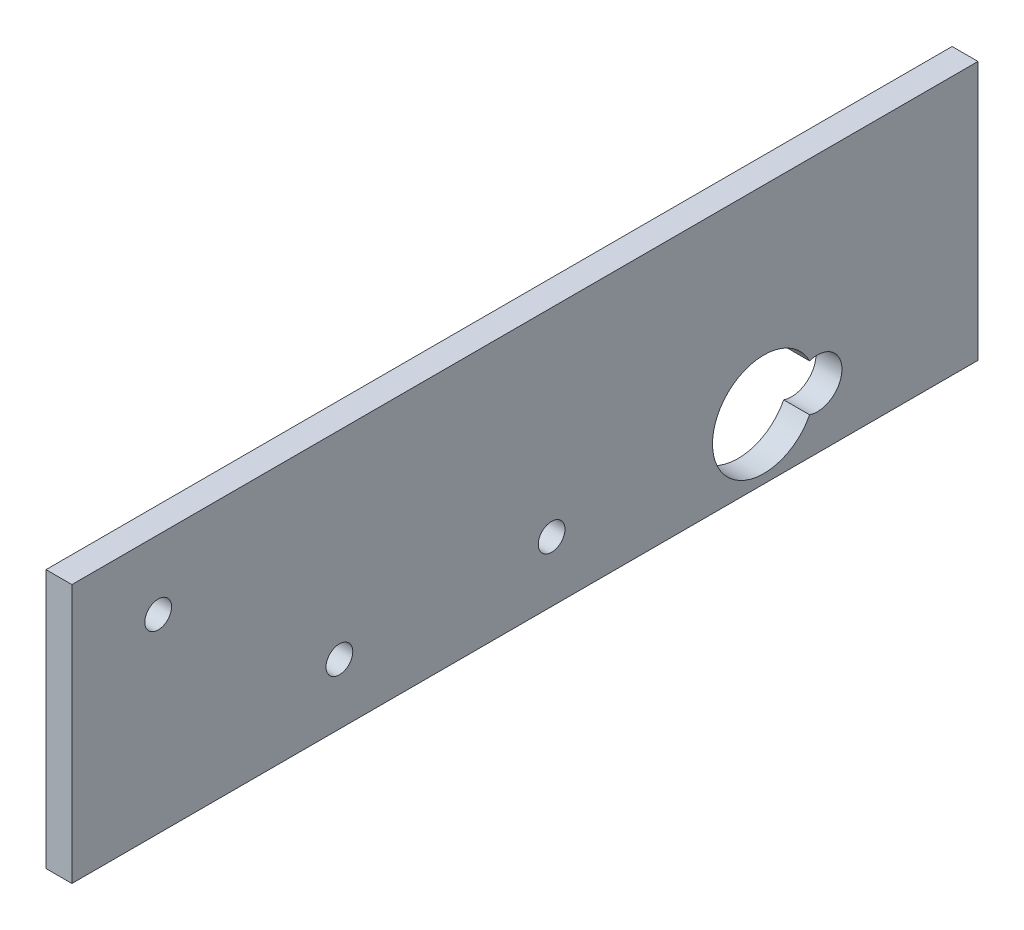
ISO-10303-21;
HEADER;
FILE_DESCRIPTION(('STEP AP214'),'2;1');
FILE_NAME('part.step','',(''),(''),'','','');
FILE_SCHEMA(('AUTOMOTIVE_DESIGN { 1 0 10303 214 1 1 1 1 }'));
ENDSEC;
DATA;
#1=APPLICATION_CONTEXT('core data for automotive mechanical design processes');
#2=APPLICATION_PROTOCOL_DEFINITION('international standard','automotive_design',2000,#1);
#3=PRODUCT_CONTEXT('',#1,'mechanical');
#4=PRODUCT('Part','Part','',(#3));
#5=PRODUCT_RELATED_PRODUCT_CATEGORY('part','',(#4));
#6=PRODUCT_DEFINITION_FORMATION('','',#4);
#7=PRODUCT_DEFINITION_CONTEXT('part definition',#1,'design');
#8=PRODUCT_DEFINITION('design','',#6,#7);
#9=PRODUCT_DEFINITION_SHAPE('','',#8);
#10=(LENGTH_UNIT() NAMED_UNIT(*) SI_UNIT(.MILLI.,.METRE.));
#11=(NAMED_UNIT(*) PLANE_ANGLE_UNIT() SI_UNIT($,.RADIAN.));
#12=(NAMED_UNIT(*) SI_UNIT($,.STERADIAN.) SOLID_ANGLE_UNIT());
#13=UNCERTAINTY_MEASURE_WITH_UNIT(LENGTH_MEASURE(1.E-05),#10,'distance_accuracy_value','');
#14=(GEOMETRIC_REPRESENTATION_CONTEXT(3) GLOBAL_UNCERTAINTY_ASSIGNED_CONTEXT((#13)) GLOBAL_UNIT_ASSIGNED_CONTEXT((#10,
#11,#12)) REPRESENTATION_CONTEXT('',''));
#15=CARTESIAN_POINT('',(0.,0.,0.));
#16=DIRECTION('',(0.,0.,1.));
#17=DIRECTION('',(1.,0.,0.));
#18=AXIS2_PLACEMENT_3D('',#15,#16,#17);
#19=CARTESIAN_POINT('',(3.,0.,0.));
#20=DIRECTION('',(0.,0.,-1.));
#21=DIRECTION('',(-1.,0.,0.));
#22=AXIS2_PLACEMENT_3D('',#19,#20,#21);
#23=PLANE('',#22);
#24=DIRECTION('',(0.,-1.,0.));
#25=VECTOR('',#24,1.);
#26=CARTESIAN_POINT('',(0.,0.,0.));
#27=LINE('',#26,#25);
#28=CARTESIAN_POINT('',(0.,30.,0.));
#29=VERTEX_POINT('',#28);
#30=CARTESIAN_POINT('',(0.,0.,0.));
#31=VERTEX_POINT('',#30);
#32=EDGE_CURVE('E118',#29,#31,#27,.T.);
#33=ORIENTED_EDGE('',*,*,#32,.T.);
#34=DIRECTION('',(-1.,0.,0.));
#35=VECTOR('',#34,1.);
#36=CARTESIAN_POINT('',(3.,0.,0.));
#37=LINE('',#36,#35);
#38=CARTESIAN_POINT('',(3.,0.,0.));
#39=VERTEX_POINT('',#38);
#40=EDGE_CURVE('E11',#39,#31,#37,.T.);
#41=ORIENTED_EDGE('',*,*,#40,.F.);
#42=DIRECTION('',(0.,-1.,0.));
#43=VECTOR('',#42,1.);
#44=CARTESIAN_POINT('',(3.,0.,0.));
#45=LINE('',#44,#43);
#46=CARTESIAN_POINT('',(3.,30.,0.));
#47=VERTEX_POINT('',#46);
#48=EDGE_CURVE('E139',#47,#39,#45,.T.);
#49=ORIENTED_EDGE('',*,*,#48,.F.);
#50=DIRECTION('',(-1.,0.,0.));
#51=VECTOR('',#50,1.);
#52=CARTESIAN_POINT('',(3.,30.,0.));
#53=LINE('',#52,#51);
#54=EDGE_CURVE('E153',#47,#29,#53,.T.);
#55=ORIENTED_EDGE('',*,*,#54,.T.);
#56=EDGE_LOOP('',(#33,#41,#49,#55));
#57=FACE_BOUND('',#56,.T.);
#58=ADVANCED_FACE('F39',(#57),#23,.F.);
#59=CARTESIAN_POINT('',(3.,0.,0.));
#60=DIRECTION('',(0.,1.,0.));
#61=DIRECTION('',(0.,0.,1.));
#62=AXIS2_PLACEMENT_3D('',#59,#60,#61);
#63=PLANE('',#62);
#64=DIRECTION('',(0.,0.,-1.));
#65=VECTOR('',#64,1.);
#66=CARTESIAN_POINT('',(0.,0.,0.));
#67=LINE('',#66,#65);
#68=CARTESIAN_POINT('',(0.,0.,-105.));
#69=VERTEX_POINT('',#68);
#70=EDGE_CURVE('E157',#31,#69,#67,.T.);
#71=ORIENTED_EDGE('',*,*,#70,.T.);
#72=DIRECTION('',(-1.,0.,0.));
#73=VECTOR('',#72,1.);
#74=CARTESIAN_POINT('',(3.,0.,-105.));
#75=LINE('',#74,#73);
#76=CARTESIAN_POINT('',(3.,0.,-105.));
#77=VERTEX_POINT('',#76);
#78=EDGE_CURVE('E47',#77,#69,#75,.T.);
#79=ORIENTED_EDGE('',*,*,#78,.F.);
#80=DIRECTION('',(0.,0.,-1.));
#81=VECTOR('',#80,1.);
#82=CARTESIAN_POINT('',(3.,0.,0.));
#83=LINE('',#82,#81);
#84=EDGE_CURVE('E143',#39,#77,#83,.T.);
#85=ORIENTED_EDGE('',*,*,#84,.F.);
#86=ORIENTED_EDGE('',*,*,#40,.T.);
#87=EDGE_LOOP('',(#71,#79,#85,#86));
#88=FACE_BOUND('',#87,.T.);
#89=ADVANCED_FACE('F192',(#88),#63,.F.);
#90=CARTESIAN_POINT('',(3.,0.,-105.));
#91=DIRECTION('',(0.,0.,1.));
#92=DIRECTION('',(1.,0.,0.));
#93=AXIS2_PLACEMENT_3D('',#90,#91,#92);
#94=PLANE('',#93);
#95=DIRECTION('',(0.,1.,0.));
#96=VECTOR('',#95,1.);
#97=CARTESIAN_POINT('',(0.,0.,-105.));
#98=LINE('',#97,#96);
#99=CARTESIAN_POINT('',(0.,30.,-105.));
#100=VERTEX_POINT('',#99);
#101=EDGE_CURVE('E160',#69,#100,#98,.T.);
#102=ORIENTED_EDGE('',*,*,#101,.T.);
#103=DIRECTION('',(-1.,0.,0.));
#104=VECTOR('',#103,1.);
#105=CARTESIAN_POINT('',(3.,30.,-105.));
#106=LINE('',#105,#104);
#107=CARTESIAN_POINT('',(3.,30.,-105.));
#108=VERTEX_POINT('',#107);
#109=EDGE_CURVE('E168',#108,#100,#106,.T.);
#110=ORIENTED_EDGE('',*,*,#109,.F.);
#111=DIRECTION('',(0.,1.,0.));
#112=VECTOR('',#111,1.);
#113=CARTESIAN_POINT('',(3.,0.,-105.));
#114=LINE('',#113,#112);
#115=EDGE_CURVE('E147',#77,#108,#114,.T.);
#116=ORIENTED_EDGE('',*,*,#115,.F.);
#117=ORIENTED_EDGE('',*,*,#78,.T.);
#118=EDGE_LOOP('',(#102,#110,#116,#117));
#119=FACE_BOUND('',#118,.T.);
#120=ADVANCED_FACE('F177',(#119),#94,.F.);
#121=CARTESIAN_POINT('',(3.,30.,0.));
#122=DIRECTION('',(0.,-1.,0.));
#123=DIRECTION('',(0.,0.,-1.));
#124=AXIS2_PLACEMENT_3D('',#121,#122,#123);
#125=PLANE('',#124);
#126=DIRECTION('',(0.,0.,1.));
#127=VECTOR('',#126,1.);
#128=CARTESIAN_POINT('',(0.,30.,0.));
#129=LINE('',#128,#127);
#130=EDGE_CURVE('E144',#100,#29,#129,.T.);
#131=ORIENTED_EDGE('',*,*,#130,.T.);
#132=ORIENTED_EDGE('',*,*,#54,.F.);
#133=DIRECTION('',(0.,0.,1.));
#134=VECTOR('',#133,1.);
#135=CARTESIAN_POINT('',(3.,30.,0.));
#136=LINE('',#135,#134);
#137=EDGE_CURVE('E150',#108,#47,#136,.T.);
#138=ORIENTED_EDGE('',*,*,#137,.F.);
#139=ORIENTED_EDGE('',*,*,#109,.T.);
#140=EDGE_LOOP('',(#131,#132,#138,#139));
#141=FACE_BOUND('',#140,.T.);
#142=ADVANCED_FACE('F185',(#141),#125,.F.);
#143=CARTESIAN_POINT('',(3.,0.,0.));
#144=DIRECTION('',(-1.,0.,0.));
#145=DIRECTION('',(0.,0.,1.));
#146=AXIS2_PLACEMENT_3D('',#143,#144,#145);
#147=PLANE('',#146);
#148=CARTESIAN_POINT('',(3.,7.,-80.183749339151));
#149=DIRECTION('',(-1.,0.,0.));
#150=DIRECTION('',(0.,0.,1.));
#151=AXIS2_PLACEMENT_3D('',#148,#149,#150);
#152=CIRCLE('',#151,5.94999999999999);
#153=CARTESIAN_POINT('',(3.,4.29583654340201,-85.483749339151));
#154=VERTEX_POINT('',#153);
#155=CARTESIAN_POINT('',(3.,9.704163456598,-85.483749339151));
#156=VERTEX_POINT('',#155);
#157=EDGE_CURVE('E92',#154,#156,#152,.T.);
#158=ORIENTED_EDGE('',*,*,#157,.T.);
#159=CARTESIAN_POINT('',(3.,7.,-86.3837493391511));
#160=DIRECTION('',(-1.,0.,0.));
#161=DIRECTION('',(0.,0.,1.));
#162=AXIS2_PLACEMENT_3D('',#159,#160,#161);
#163=CIRCLE('',#162,2.85000000000001);
#164=EDGE_CURVE('E113',#156,#154,#163,.T.);
#165=ORIENTED_EDGE('',*,*,#164,.T.);
#166=EDGE_LOOP('',(#158,#165));
#167=FACE_BOUND('',#166,.T.);
#168=CARTESIAN_POINT('',(3.,22.,-10.));
#169=DIRECTION('',(1.,0.,0.));
#170=DIRECTION('',(0.,0.,-1.));
#171=AXIS2_PLACEMENT_3D('',#168,#169,#170);
#172=CIRCLE('',#171,1.55);
#173=CARTESIAN_POINT('',(3.,22.,-11.55));
#174=VERTEX_POINT('',#173);
#175=EDGE_CURVE('E119',#174,#174,#172,.T.);
#176=ORIENTED_EDGE('',*,*,#175,.F.);
#177=EDGE_LOOP('',(#176));
#178=FACE_BOUND('',#177,.T.);
#179=CARTESIAN_POINT('',(3.,7.,-31.));
#180=DIRECTION('',(1.,0.,0.));
#181=DIRECTION('',(0.,0.,-1.));
#182=AXIS2_PLACEMENT_3D('',#179,#180,#181);
#183=CIRCLE('',#182,1.54999999999999);
#184=CARTESIAN_POINT('',(3.,7.,-32.55));
#185=VERTEX_POINT('',#184);
#186=EDGE_CURVE('E127',#185,#185,#183,.T.);
#187=ORIENTED_EDGE('',*,*,#186,.F.);
#188=EDGE_LOOP('',(#187));
#189=FACE_BOUND('',#188,.T.);
#190=CARTESIAN_POINT('',(3.,7.,-55.5918746695755));
#191=DIRECTION('',(1.,0.,0.));
#192=DIRECTION('',(0.,0.,-1.));
#193=AXIS2_PLACEMENT_3D('',#190,#191,#192);
#194=CIRCLE('',#193,1.55);
#195=CARTESIAN_POINT('',(3.,7.,-57.1418746695755));
#196=VERTEX_POINT('',#195);
#197=EDGE_CURVE('E135',#196,#196,#194,.T.);
#198=ORIENTED_EDGE('',*,*,#197,.F.);
#199=EDGE_LOOP('',(#198));
#200=FACE_BOUND('',#199,.T.);
#201=ORIENTED_EDGE('',*,*,#48,.T.);
#202=ORIENTED_EDGE('',*,*,#84,.T.);
#203=ORIENTED_EDGE('',*,*,#115,.T.);
#204=ORIENTED_EDGE('',*,*,#137,.T.);
#205=EDGE_LOOP('',(#201,#202,#203,#204));
#206=FACE_BOUND('',#205,.T.);
#207=ADVANCED_FACE('F191',(#167,#178,#189,#200,#206),#147,.F.);
#208=CARTESIAN_POINT('',(0.,0.,0.));
#209=DIRECTION('',(-1.,0.,0.));
#210=DIRECTION('',(0.,0.,1.));
#211=AXIS2_PLACEMENT_3D('',#208,#209,#210);
#212=PLANE('',#211);
#213=CARTESIAN_POINT('',(0.,7.,-86.3837493391511));
#214=DIRECTION('',(1.,0.,0.));
#215=DIRECTION('',(0.,0.,-1.));
#216=AXIS2_PLACEMENT_3D('',#213,#214,#215);
#217=CIRCLE('',#216,2.85000000000001);
#218=CARTESIAN_POINT('',(0.,4.295836543402,-85.483749339151));
#219=VERTEX_POINT('',#218);
#220=CARTESIAN_POINT('',(0.,9.704163456598,-85.483749339151));
#221=VERTEX_POINT('',#220);
#222=EDGE_CURVE('E98',#219,#221,#217,.T.);
#223=ORIENTED_EDGE('',*,*,#222,.T.);
#224=CARTESIAN_POINT('',(0.,7.,-80.183749339151));
#225=DIRECTION('',(1.,0.,0.));
#226=DIRECTION('',(0.,0.,-1.));
#227=AXIS2_PLACEMENT_3D('',#224,#225,#226);
#228=CIRCLE('',#227,5.94999999999999);
#229=EDGE_CURVE('E61',#221,#219,#228,.T.);
#230=ORIENTED_EDGE('',*,*,#229,.T.);
#231=EDGE_LOOP('',(#223,#230));
#232=FACE_BOUND('',#231,.T.);
#233=CARTESIAN_POINT('',(0.,22.,-10.));
#234=DIRECTION('',(1.,0.,0.));
#235=DIRECTION('',(0.,0.,-1.));
#236=AXIS2_PLACEMENT_3D('',#233,#234,#235);
#237=CIRCLE('',#236,1.55);
#238=CARTESIAN_POINT('',(0.,22.,-11.55));
#239=VERTEX_POINT('',#238);
#240=EDGE_CURVE('E114',#239,#239,#237,.T.);
#241=ORIENTED_EDGE('',*,*,#240,.T.);
#242=EDGE_LOOP('',(#241));
#243=FACE_BOUND('',#242,.T.);
#244=CARTESIAN_POINT('',(0.,7.,-31.));
#245=DIRECTION('',(1.,0.,0.));
#246=DIRECTION('',(0.,0.,-1.));
#247=AXIS2_PLACEMENT_3D('',#244,#245,#246);
#248=CIRCLE('',#247,1.54999999999999);
#249=CARTESIAN_POINT('',(0.,7.,-32.55));
#250=VERTEX_POINT('',#249);
#251=EDGE_CURVE('E123',#250,#250,#248,.T.);
#252=ORIENTED_EDGE('',*,*,#251,.T.);
#253=EDGE_LOOP('',(#252));
#254=FACE_BOUND('',#253,.T.);
#255=CARTESIAN_POINT('',(0.,7.,-55.5918746695755));
#256=DIRECTION('',(1.,0.,0.));
#257=DIRECTION('',(0.,0.,-1.));
#258=AXIS2_PLACEMENT_3D('',#255,#256,#257);
#259=CIRCLE('',#258,1.55);
#260=CARTESIAN_POINT('',(0.,7.,-57.1418746695755));
#261=VERTEX_POINT('',#260);
#262=EDGE_CURVE('E131',#261,#261,#259,.T.);
#263=ORIENTED_EDGE('',*,*,#262,.T.);
#264=EDGE_LOOP('',(#263));
#265=FACE_BOUND('',#264,.T.);
#266=ORIENTED_EDGE('',*,*,#32,.F.);
#267=ORIENTED_EDGE('',*,*,#130,.F.);
#268=ORIENTED_EDGE('',*,*,#101,.F.);
#269=ORIENTED_EDGE('',*,*,#70,.F.);
#270=EDGE_LOOP('',(#266,#267,#268,#269));
#271=FACE_BOUND('',#270,.T.);
#272=ADVANCED_FACE('F103',(#232,#243,#254,#265,#271),#212,.T.);
#273=CARTESIAN_POINT('',(0.,7.,-55.5918746695755));
#274=DIRECTION('',(1.,0.,0.));
#275=DIRECTION('',(0.,0.,-1.));
#276=AXIS2_PLACEMENT_3D('',#273,#274,#275);
#277=CYLINDRICAL_SURFACE('',#276,1.55);
#278=ORIENTED_EDGE('',*,*,#262,.F.);
#279=EDGE_LOOP('',(#278));
#280=FACE_BOUND('',#279,.T.);
#281=ORIENTED_EDGE('',*,*,#197,.T.);
#282=EDGE_LOOP('',(#281));
#283=FACE_BOUND('',#282,.T.);
#284=ADVANCED_FACE('F204',(#280,#283),#277,.F.);
#285=CARTESIAN_POINT('',(0.,7.,-31.));
#286=DIRECTION('',(1.,0.,0.));
#287=DIRECTION('',(0.,0.,-1.));
#288=AXIS2_PLACEMENT_3D('',#285,#286,#287);
#289=CYLINDRICAL_SURFACE('',#288,1.54999999999999);
#290=ORIENTED_EDGE('',*,*,#251,.F.);
#291=EDGE_LOOP('',(#290));
#292=FACE_BOUND('',#291,.T.);
#293=ORIENTED_EDGE('',*,*,#186,.T.);
#294=EDGE_LOOP('',(#293));
#295=FACE_BOUND('',#294,.T.);
#296=ADVANCED_FACE('F210',(#292,#295),#289,.F.);
#297=CARTESIAN_POINT('',(0.,22.,-10.));
#298=DIRECTION('',(1.,0.,0.));
#299=DIRECTION('',(0.,0.,-1.));
#300=AXIS2_PLACEMENT_3D('',#297,#298,#299);
#301=CYLINDRICAL_SURFACE('',#300,1.55);
#302=ORIENTED_EDGE('',*,*,#240,.F.);
#303=EDGE_LOOP('',(#302));
#304=FACE_BOUND('',#303,.T.);
#305=ORIENTED_EDGE('',*,*,#175,.T.);
#306=EDGE_LOOP('',(#305));
#307=FACE_BOUND('',#306,.T.);
#308=ADVANCED_FACE('F214',(#304,#307),#301,.F.);
#309=CARTESIAN_POINT('',(22.147062437878,7.,-80.183749339151));
#310=DIRECTION('',(-1.,0.,0.));
#311=DIRECTION('',(0.,0.,1.));
#312=AXIS2_PLACEMENT_3D('',#309,#310,#311);
#313=CYLINDRICAL_SURFACE('',#312,5.94999999999999);
#314=DIRECTION('',(-1.,0.,0.));
#315=VECTOR('',#314,1.);
#316=CARTESIAN_POINT('',(22.147062437878,4.295836543402,-85.483749339151));
#317=LINE('',#316,#315);
#318=EDGE_CURVE('E54',#154,#219,#317,.T.);
#319=ORIENTED_EDGE('',*,*,#318,.T.);
#320=ORIENTED_EDGE('',*,*,#229,.F.);
#321=DIRECTION('',(-1.,0.,0.));
#322=VECTOR('',#321,1.);
#323=CARTESIAN_POINT('',(22.147062437878,9.704163456598,-85.483749339151));
#324=LINE('',#323,#322);
#325=EDGE_CURVE('E95',#156,#221,#324,.T.);
#326=ORIENTED_EDGE('',*,*,#325,.F.);
#327=ORIENTED_EDGE('',*,*,#157,.F.);
#328=EDGE_LOOP('',(#319,#320,#326,#327));
#329=FACE_BOUND('',#328,.T.);
#330=ADVANCED_FACE('F90',(#329),#313,.F.);
#331=CARTESIAN_POINT('',(22.147062437878,7.,-86.3837493391511));
#332=DIRECTION('',(-1.,0.,0.));
#333=DIRECTION('',(0.,0.,1.));
#334=AXIS2_PLACEMENT_3D('',#331,#332,#333);
#335=CYLINDRICAL_SURFACE('',#334,2.85000000000001);
#336=ORIENTED_EDGE('',*,*,#325,.T.);
#337=ORIENTED_EDGE('',*,*,#222,.F.);
#338=ORIENTED_EDGE('',*,*,#318,.F.);
#339=ORIENTED_EDGE('',*,*,#164,.F.);
#340=EDGE_LOOP('',(#336,#337,#338,#339));
#341=FACE_BOUND('',#340,.T.);
#342=ADVANCED_FACE('F99',(#341),#335,.F.);
#343=CLOSED_SHELL('',(#58,#89,#120,#142,#207,#272,#284,#296,#308,#330,#342));
#344=MANIFOLD_SOLID_BREP('B2',#343);
#345=ADVANCED_BREP_SHAPE_REPRESENTATION('',(#18,#344),#14);
#346=SHAPE_DEFINITION_REPRESENTATION(#9,#345);
ENDSEC;
END-ISO-10303-21;
